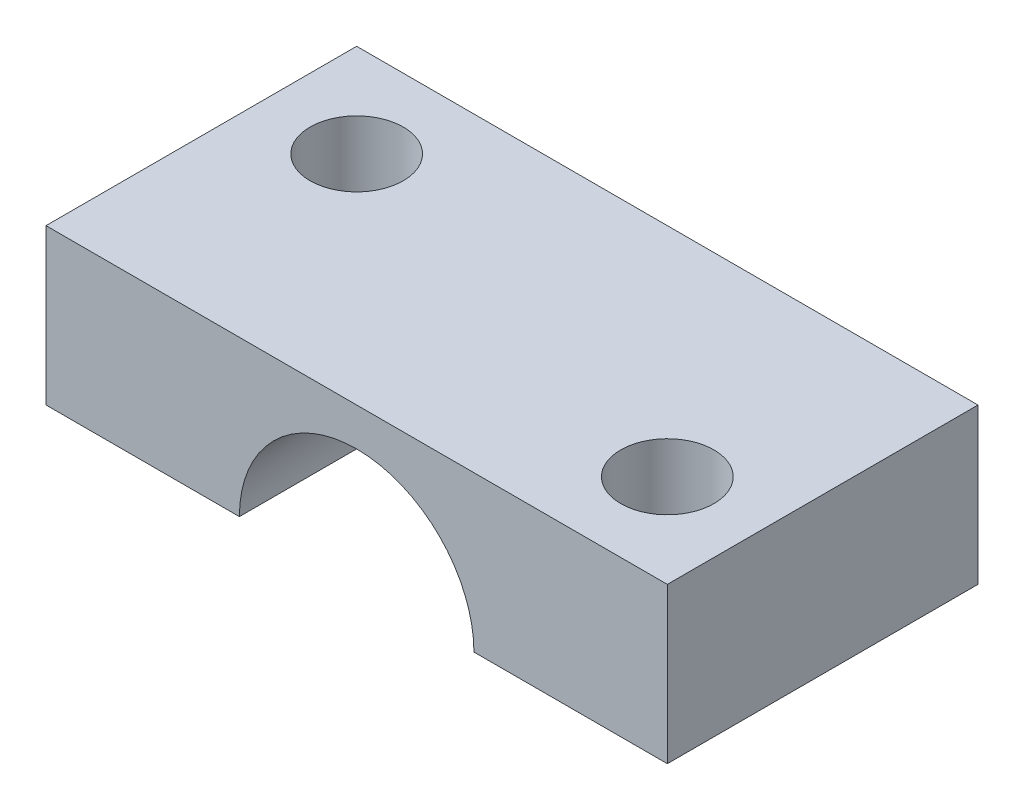
ISO-10303-21;
HEADER;
FILE_DESCRIPTION(('STEP AP214'),'2;1');
FILE_NAME('part.step','',(''),(''),'','','');
FILE_SCHEMA(('AUTOMOTIVE_DESIGN { 1 0 10303 214 1 1 1 1 }'));
ENDSEC;
DATA;
#1=APPLICATION_CONTEXT('core data for automotive mechanical design processes');
#2=APPLICATION_PROTOCOL_DEFINITION('international standard','automotive_design',2000,#1);
#3=PRODUCT_CONTEXT('',#1,'mechanical');
#4=PRODUCT('Part','Part','',(#3));
#5=PRODUCT_RELATED_PRODUCT_CATEGORY('part','',(#4));
#6=PRODUCT_DEFINITION_FORMATION('','',#4);
#7=PRODUCT_DEFINITION_CONTEXT('part definition',#1,'design');
#8=PRODUCT_DEFINITION('design','',#6,#7);
#9=PRODUCT_DEFINITION_SHAPE('','',#8);
#10=(LENGTH_UNIT() NAMED_UNIT(*) SI_UNIT(.MILLI.,.METRE.));
#11=(NAMED_UNIT(*) PLANE_ANGLE_UNIT() SI_UNIT($,.RADIAN.));
#12=(NAMED_UNIT(*) SI_UNIT($,.STERADIAN.) SOLID_ANGLE_UNIT());
#13=UNCERTAINTY_MEASURE_WITH_UNIT(LENGTH_MEASURE(1.E-05),#10,'distance_accuracy_value','');
#14=(GEOMETRIC_REPRESENTATION_CONTEXT(3) GLOBAL_UNCERTAINTY_ASSIGNED_CONTEXT((#13)) GLOBAL_UNIT_ASSIGNED_CONTEXT((#10,
#11,#12)) REPRESENTATION_CONTEXT('',''));
#15=CARTESIAN_POINT('',(0.,0.,0.));
#16=DIRECTION('',(0.,0.,1.));
#17=DIRECTION('',(1.,0.,0.));
#18=AXIS2_PLACEMENT_3D('',#15,#16,#17);
#19=CARTESIAN_POINT('',(0.,0.,0.));
#20=DIRECTION('',(0.,-1.,0.));
#21=DIRECTION('',(0.,0.,-1.));
#22=AXIS2_PLACEMENT_3D('',#19,#20,#21);
#23=PLANE('',#22);
#24=CARTESIAN_POINT('',(-8.01616270197138,0.,7.2459815321904));
#25=DIRECTION('',(0.,1.,0.));
#26=DIRECTION('',(0.,0.,1.));
#27=AXIS2_PLACEMENT_3D('',#24,#25,#26);
#28=CIRCLE('',#27,1.5);
#29=CARTESIAN_POINT('',(-8.01616270197138,0.,8.7459815321904));
#30=VERTEX_POINT('',#29);
#31=EDGE_CURVE('E143',#30,#30,#28,.T.);
#32=ORIENTED_EDGE('',*,*,#31,.T.);
#33=EDGE_LOOP('',(#32));
#34=FACE_BOUND('',#33,.T.);
#35=DIRECTION('',(0.,0.,1.));
#36=VECTOR('',#35,1.);
#37=CARTESIAN_POINT('',(-11.2411627019714,0.,0.245981532190404));
#38=LINE('',#37,#36);
#39=CARTESIAN_POINT('',(-11.2411627019714,0.,0.245981532190404));
#40=VERTEX_POINT('',#39);
#41=CARTESIAN_POINT('',(-11.2411627019714,0.,10.2459815321904));
#42=VERTEX_POINT('',#41);
#43=EDGE_CURVE('E11',#40,#42,#38,.T.);
#44=ORIENTED_EDGE('',*,*,#43,.F.);
#45=DIRECTION('',(-1.,0.,0.));
#46=VECTOR('',#45,1.);
#47=CARTESIAN_POINT('',(-25.0161627019714,0.,0.245981532190404));
#48=LINE('',#47,#46);
#49=CARTESIAN_POINT('',(-5.01616270197138,0.,0.245981532190404));
#50=VERTEX_POINT('',#49);
#51=EDGE_CURVE('E115',#50,#40,#48,.T.);
#52=ORIENTED_EDGE('',*,*,#51,.F.);
#53=DIRECTION('',(0.,0.,-1.));
#54=VECTOR('',#53,1.);
#55=CARTESIAN_POINT('',(-5.01616270197138,0.,10.2459815321904));
#56=LINE('',#55,#54);
#57=CARTESIAN_POINT('',(-5.01616270197138,0.,10.2459815321904));
#58=VERTEX_POINT('',#57);
#59=EDGE_CURVE('E107',#58,#50,#56,.T.);
#60=ORIENTED_EDGE('',*,*,#59,.F.);
#61=DIRECTION('',(1.,0.,0.));
#62=VECTOR('',#61,1.);
#63=CARTESIAN_POINT('',(-25.0161627019714,0.,10.2459815321904));
#64=LINE('',#63,#62);
#65=EDGE_CURVE('E101',#42,#58,#64,.T.);
#66=ORIENTED_EDGE('',*,*,#65,.F.);
#67=EDGE_LOOP('',(#44,#52,#60,#66));
#68=FACE_BOUND('',#67,.T.);
#69=ADVANCED_FACE('F33',(#34,#68),#23,.T.);
#70=CARTESIAN_POINT('',(-25.0161627019714,5.,10.2459815321904));
#71=DIRECTION('',(1.,0.,0.));
#72=DIRECTION('',(0.,0.,-1.));
#73=AXIS2_PLACEMENT_3D('',#70,#71,#72);
#74=PLANE('',#73);
#75=DIRECTION('',(0.,0.,1.));
#76=VECTOR('',#75,1.);
#77=CARTESIAN_POINT('',(-25.0161627019714,0.,10.2459815321904));
#78=LINE('',#77,#76);
#79=CARTESIAN_POINT('',(-25.0161627019714,0.,0.245981532190404));
#80=VERTEX_POINT('',#79);
#81=CARTESIAN_POINT('',(-25.0161627019714,0.,10.2459815321904));
#82=VERTEX_POINT('',#81);
#83=EDGE_CURVE('E108',#80,#82,#78,.T.);
#84=ORIENTED_EDGE('',*,*,#83,.T.);
#85=DIRECTION('',(0.,-1.,0.));
#86=VECTOR('',#85,1.);
#87=CARTESIAN_POINT('',(-25.0161627019714,5.,10.2459815321904));
#88=LINE('',#87,#86);
#89=CARTESIAN_POINT('',(-25.0161627019714,5.,10.2459815321904));
#90=VERTEX_POINT('',#89);
#91=EDGE_CURVE('E125',#90,#82,#88,.T.);
#92=ORIENTED_EDGE('',*,*,#91,.F.);
#93=DIRECTION('',(0.,0.,1.));
#94=VECTOR('',#93,1.);
#95=CARTESIAN_POINT('',(-25.0161627019714,5.,10.2459815321904));
#96=LINE('',#95,#94);
#97=CARTESIAN_POINT('',(-25.0161627019714,5.,0.245981532190404));
#98=VERTEX_POINT('',#97);
#99=EDGE_CURVE('E117',#98,#90,#96,.T.);
#100=ORIENTED_EDGE('',*,*,#99,.F.);
#101=DIRECTION('',(0.,-1.,0.));
#102=VECTOR('',#101,1.);
#103=CARTESIAN_POINT('',(-25.0161627019714,5.,0.245981532190404));
#104=LINE('',#103,#102);
#105=EDGE_CURVE('E118',#98,#80,#104,.T.);
#106=ORIENTED_EDGE('',*,*,#105,.T.);
#107=EDGE_LOOP('',(#84,#92,#100,#106));
#108=FACE_BOUND('',#107,.T.);
#109=ADVANCED_FACE('F35',(#108),#74,.F.);
#110=CARTESIAN_POINT('',(-25.0161627019714,5.,10.2459815321904));
#111=DIRECTION('',(0.,0.,-1.));
#112=DIRECTION('',(-1.,0.,0.));
#113=AXIS2_PLACEMENT_3D('',#110,#111,#112);
#114=PLANE('',#113);
#115=CARTESIAN_POINT('',(-18.7911627019714,0.,10.2459815321904));
#116=VERTEX_POINT('',#115);
#117=EDGE_CURVE('E103',#82,#116,#64,.T.);
#118=ORIENTED_EDGE('',*,*,#117,.T.);
#119=CARTESIAN_POINT('',(-15.0161627019714,0.,10.2459815321904));
#120=DIRECTION('',(0.,0.,1.));
#121=DIRECTION('',(1.,0.,0.));
#122=AXIS2_PLACEMENT_3D('',#119,#120,#121);
#123=CIRCLE('',#122,3.775);
#124=EDGE_CURVE('E47',#42,#116,#123,.T.);
#125=ORIENTED_EDGE('',*,*,#124,.F.);
#126=ORIENTED_EDGE('',*,*,#65,.T.);
#127=DIRECTION('',(0.,-1.,0.));
#128=VECTOR('',#127,1.);
#129=CARTESIAN_POINT('',(-5.01616270197138,5.,10.2459815321904));
#130=LINE('',#129,#128);
#131=CARTESIAN_POINT('',(-5.01616270197138,5.,10.2459815321904));
#132=VERTEX_POINT('',#131);
#133=EDGE_CURVE('E123',#132,#58,#130,.T.);
#134=ORIENTED_EDGE('',*,*,#133,.F.);
#135=DIRECTION('',(1.,0.,0.));
#136=VECTOR('',#135,1.);
#137=CARTESIAN_POINT('',(-25.0161627019714,5.,10.2459815321904));
#138=LINE('',#137,#136);
#139=EDGE_CURVE('E85',#90,#132,#138,.T.);
#140=ORIENTED_EDGE('',*,*,#139,.F.);
#141=ORIENTED_EDGE('',*,*,#91,.T.);
#142=EDGE_LOOP('',(#118,#125,#126,#134,#140,#141));
#143=FACE_BOUND('',#142,.T.);
#144=ADVANCED_FACE('F100',(#143),#114,.F.);
#145=CARTESIAN_POINT('',(-5.01616270197138,5.,10.2459815321904));
#146=DIRECTION('',(-1.,0.,0.));
#147=DIRECTION('',(0.,0.,1.));
#148=AXIS2_PLACEMENT_3D('',#145,#146,#147);
#149=PLANE('',#148);
#150=ORIENTED_EDGE('',*,*,#59,.T.);
#151=DIRECTION('',(0.,-1.,0.));
#152=VECTOR('',#151,1.);
#153=CARTESIAN_POINT('',(-5.01616270197138,5.,0.245981532190404));
#154=LINE('',#153,#152);
#155=CARTESIAN_POINT('',(-5.01616270197138,5.,0.245981532190404));
#156=VERTEX_POINT('',#155);
#157=EDGE_CURVE('E120',#156,#50,#154,.T.);
#158=ORIENTED_EDGE('',*,*,#157,.F.);
#159=DIRECTION('',(0.,0.,-1.));
#160=VECTOR('',#159,1.);
#161=CARTESIAN_POINT('',(-5.01616270197138,5.,10.2459815321904));
#162=LINE('',#161,#160);
#163=EDGE_CURVE('E135',#132,#156,#162,.T.);
#164=ORIENTED_EDGE('',*,*,#163,.F.);
#165=ORIENTED_EDGE('',*,*,#133,.T.);
#166=EDGE_LOOP('',(#150,#158,#164,#165));
#167=FACE_BOUND('',#166,.T.);
#168=ADVANCED_FACE('F167',(#167),#149,.F.);
#169=CARTESIAN_POINT('',(-25.0161627019714,5.,0.245981532190404));
#170=DIRECTION('',(0.,0.,1.));
#171=DIRECTION('',(1.,0.,0.));
#172=AXIS2_PLACEMENT_3D('',#169,#170,#171);
#173=PLANE('',#172);
#174=ORIENTED_EDGE('',*,*,#51,.T.);
#175=CARTESIAN_POINT('',(-15.0161627019714,0.,0.245981532190404));
#176=DIRECTION('',(0.,0.,1.));
#177=DIRECTION('',(1.,0.,0.));
#178=AXIS2_PLACEMENT_3D('',#175,#176,#177);
#179=CIRCLE('',#178,3.775);
#180=CARTESIAN_POINT('',(-18.7911627019714,0.,0.245981532190404));
#181=VERTEX_POINT('',#180);
#182=EDGE_CURVE('E94',#40,#181,#179,.T.);
#183=ORIENTED_EDGE('',*,*,#182,.T.);
#184=EDGE_CURVE('E77',#181,#80,#48,.T.);
#185=ORIENTED_EDGE('',*,*,#184,.T.);
#186=ORIENTED_EDGE('',*,*,#105,.F.);
#187=DIRECTION('',(-1.,0.,0.));
#188=VECTOR('',#187,1.);
#189=CARTESIAN_POINT('',(-25.0161627019714,5.,0.245981532190404));
#190=LINE('',#189,#188);
#191=EDGE_CURVE('E56',#156,#98,#190,.T.);
#192=ORIENTED_EDGE('',*,*,#191,.F.);
#193=ORIENTED_EDGE('',*,*,#157,.T.);
#194=EDGE_LOOP('',(#174,#183,#185,#186,#192,#193));
#195=FACE_BOUND('',#194,.T.);
#196=ADVANCED_FACE('F127',(#195),#173,.F.);
#197=CARTESIAN_POINT('',(0.,5.,0.));
#198=DIRECTION('',(0.,-1.,0.));
#199=DIRECTION('',(0.,0.,-1.));
#200=AXIS2_PLACEMENT_3D('',#197,#198,#199);
#201=PLANE('',#200);
#202=CARTESIAN_POINT('',(-8.01616270197138,5.,7.2459815321904));
#203=DIRECTION('',(0.,1.,0.));
#204=DIRECTION('',(0.,0.,1.));
#205=AXIS2_PLACEMENT_3D('',#202,#203,#204);
#206=CIRCLE('',#205,1.5);
#207=CARTESIAN_POINT('',(-8.01616270197138,5.,8.7459815321904));
#208=VERTEX_POINT('',#207);
#209=EDGE_CURVE('E146',#208,#208,#206,.T.);
#210=ORIENTED_EDGE('',*,*,#209,.F.);
#211=EDGE_LOOP('',(#210));
#212=FACE_BOUND('',#211,.T.);
#213=CARTESIAN_POINT('',(-22.0161627019714,5.,3.2459815321904));
#214=DIRECTION('',(0.,1.,0.));
#215=DIRECTION('',(0.,0.,1.));
#216=AXIS2_PLACEMENT_3D('',#213,#214,#215);
#217=CIRCLE('',#216,1.5);
#218=CARTESIAN_POINT('',(-22.0161627019714,5.,4.7459815321904));
#219=VERTEX_POINT('',#218);
#220=EDGE_CURVE('E140',#219,#219,#217,.T.);
#221=ORIENTED_EDGE('',*,*,#220,.F.);
#222=EDGE_LOOP('',(#221));
#223=FACE_BOUND('',#222,.T.);
#224=ORIENTED_EDGE('',*,*,#99,.T.);
#225=ORIENTED_EDGE('',*,*,#139,.T.);
#226=ORIENTED_EDGE('',*,*,#163,.T.);
#227=ORIENTED_EDGE('',*,*,#191,.T.);
#228=EDGE_LOOP('',(#224,#225,#226,#227));
#229=FACE_BOUND('',#228,.T.);
#230=ADVANCED_FACE('F160',(#212,#223,#229),#201,.F.);
#231=CARTESIAN_POINT('',(-22.0161627019714,0.,3.2459815321904));
#232=DIRECTION('',(0.,1.,0.));
#233=DIRECTION('',(0.,0.,1.));
#234=AXIS2_PLACEMENT_3D('',#231,#232,#233);
#235=CIRCLE('',#234,1.5);
#236=CARTESIAN_POINT('',(-22.0161627019714,0.,4.7459815321904));
#237=VERTEX_POINT('',#236);
#238=EDGE_CURVE('E104',#237,#237,#235,.T.);
#239=ORIENTED_EDGE('',*,*,#238,.T.);
#240=EDGE_LOOP('',(#239));
#241=FACE_BOUND('',#240,.T.);
#242=DIRECTION('',(0.,0.,1.));
#243=VECTOR('',#242,1.);
#244=CARTESIAN_POINT('',(-18.7911627019714,0.,0.245981532190404));
#245=LINE('',#244,#243);
#246=EDGE_CURVE('E41',#116,#181,#245,.F.);
#247=ORIENTED_EDGE('',*,*,#246,.F.);
#248=ORIENTED_EDGE('',*,*,#117,.F.);
#249=ORIENTED_EDGE('',*,*,#83,.F.);
#250=ORIENTED_EDGE('',*,*,#184,.F.);
#251=EDGE_LOOP('',(#247,#248,#249,#250));
#252=FACE_BOUND('',#251,.T.);
#253=ADVANCED_FACE('F130',(#241,#252),#23,.T.);
#254=CARTESIAN_POINT('',(-15.0161627019714,0.,0.245981532190404));
#255=DIRECTION('',(0.,0.,1.));
#256=DIRECTION('',(1.,0.,0.));
#257=AXIS2_PLACEMENT_3D('',#254,#255,#256);
#258=CYLINDRICAL_SURFACE('',#257,3.775);
#259=ORIENTED_EDGE('',*,*,#43,.T.);
#260=ORIENTED_EDGE('',*,*,#124,.T.);
#261=ORIENTED_EDGE('',*,*,#246,.T.);
#262=ORIENTED_EDGE('',*,*,#182,.F.);
#263=EDGE_LOOP('',(#259,#260,#261,#262));
#264=FACE_BOUND('',#263,.T.);
#265=ADVANCED_FACE('F93',(#264),#258,.F.);
#266=CARTESIAN_POINT('',(-22.0161627019714,0.,3.2459815321904));
#267=DIRECTION('',(0.,1.,0.));
#268=DIRECTION('',(0.,0.,1.));
#269=AXIS2_PLACEMENT_3D('',#266,#267,#268);
#270=CYLINDRICAL_SURFACE('',#269,1.5);
#271=ORIENTED_EDGE('',*,*,#238,.F.);
#272=EDGE_LOOP('',(#271));
#273=FACE_BOUND('',#272,.T.);
#274=ORIENTED_EDGE('',*,*,#220,.T.);
#275=EDGE_LOOP('',(#274));
#276=FACE_BOUND('',#275,.T.);
#277=ADVANCED_FACE('F156',(#273,#276),#270,.F.);
#278=CARTESIAN_POINT('',(-8.01616270197138,0.,7.2459815321904));
#279=DIRECTION('',(0.,1.,0.));
#280=DIRECTION('',(0.,0.,1.));
#281=AXIS2_PLACEMENT_3D('',#278,#279,#280);
#282=CYLINDRICAL_SURFACE('',#281,1.5);
#283=ORIENTED_EDGE('',*,*,#31,.F.);
#284=EDGE_LOOP('',(#283));
#285=FACE_BOUND('',#284,.T.);
#286=ORIENTED_EDGE('',*,*,#209,.T.);
#287=EDGE_LOOP('',(#286));
#288=FACE_BOUND('',#287,.T.);
#289=ADVANCED_FACE('F153',(#285,#288),#282,.F.);
#290=CLOSED_SHELL('',(#69,#109,#144,#168,#196,#230,#253,#265,#277,#289));
#291=MANIFOLD_SOLID_BREP('B2',#290);
#292=ADVANCED_BREP_SHAPE_REPRESENTATION('',(#18,#291),#14);
#293=SHAPE_DEFINITION_REPRESENTATION(#9,#292);
ENDSEC;
END-ISO-10303-21;
